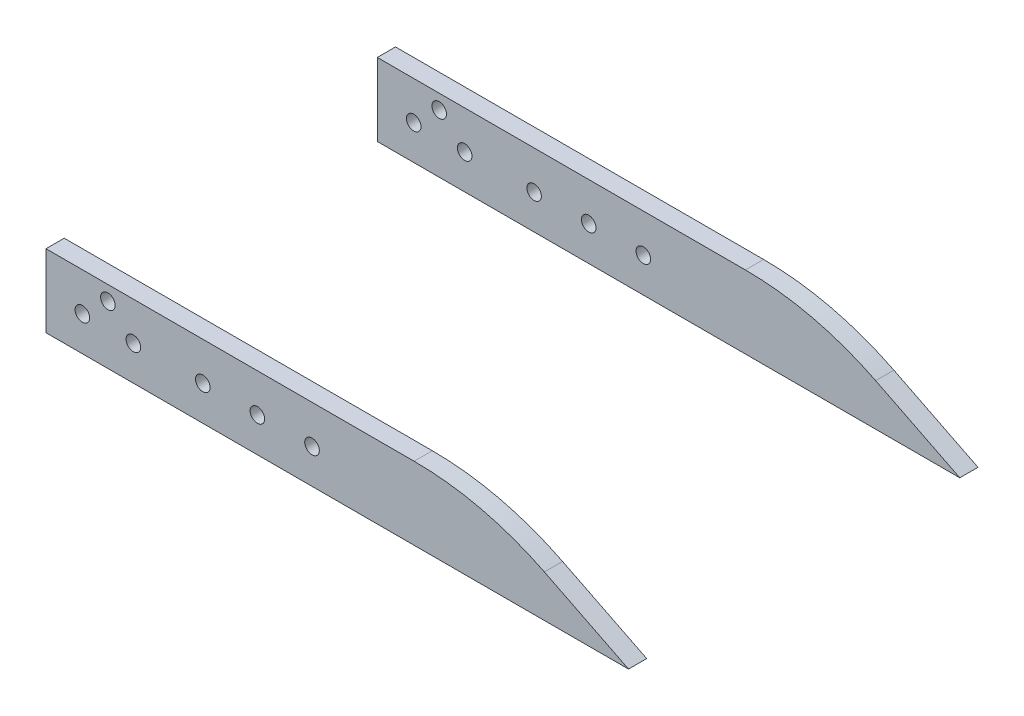
ISO-10303-21;
HEADER;
FILE_DESCRIPTION(('STEP AP214'),'2;1');
FILE_NAME('part.step','',(''),(''),'','','');
FILE_SCHEMA(('AUTOMOTIVE_DESIGN { 1 0 10303 214 1 1 1 1 }'));
ENDSEC;
DATA;
#1=APPLICATION_CONTEXT('core data for automotive mechanical design processes');
#2=APPLICATION_PROTOCOL_DEFINITION('international standard','automotive_design',2000,#1);
#3=PRODUCT_CONTEXT('',#1,'mechanical');
#4=PRODUCT('Part','Part','',(#3));
#5=PRODUCT_RELATED_PRODUCT_CATEGORY('part','',(#4));
#6=PRODUCT_DEFINITION_FORMATION('','',#4);
#7=PRODUCT_DEFINITION_CONTEXT('part definition',#1,'design');
#8=PRODUCT_DEFINITION('design','',#6,#7);
#9=PRODUCT_DEFINITION_SHAPE('','',#8);
#10=(LENGTH_UNIT() NAMED_UNIT(*) SI_UNIT(.MILLI.,.METRE.));
#11=(NAMED_UNIT(*) PLANE_ANGLE_UNIT() SI_UNIT($,.RADIAN.));
#12=(NAMED_UNIT(*) SI_UNIT($,.STERADIAN.) SOLID_ANGLE_UNIT());
#13=UNCERTAINTY_MEASURE_WITH_UNIT(LENGTH_MEASURE(1.E-05),#10,'distance_accuracy_value','');
#14=(GEOMETRIC_REPRESENTATION_CONTEXT(3) GLOBAL_UNCERTAINTY_ASSIGNED_CONTEXT((#13)) GLOBAL_UNIT_ASSIGNED_CONTEXT((#10,
#11,#12)) REPRESENTATION_CONTEXT('',''));
#15=CARTESIAN_POINT('',(0.,0.,0.));
#16=DIRECTION('',(0.,0.,1.));
#17=DIRECTION('',(1.,0.,0.));
#18=AXIS2_PLACEMENT_3D('',#15,#16,#17);
#19=CARTESIAN_POINT('',(0.,0.,5.));
#20=DIRECTION('',(0.,-1.,0.));
#21=DIRECTION('',(0.,0.,-1.));
#22=AXIS2_PLACEMENT_3D('',#19,#20,#21);
#23=PLANE('',#22);
#24=DIRECTION('',(-1.,0.,0.));
#25=VECTOR('',#24,1.);
#26=CARTESIAN_POINT('',(0.,0.,0.));
#27=LINE('',#26,#25);
#28=CARTESIAN_POINT('',(101.114561800017,0.,0.));
#29=VERTEX_POINT('',#28);
#30=CARTESIAN_POINT('',(0.,0.,0.));
#31=VERTEX_POINT('',#30);
#32=EDGE_CURVE('E116',#29,#31,#27,.T.);
#33=ORIENTED_EDGE('',*,*,#32,.T.);
#34=DIRECTION('',(0.,0.,-1.));
#35=VECTOR('',#34,1.);
#36=CARTESIAN_POINT('',(0.,0.,5.));
#37=LINE('',#36,#35);
#38=CARTESIAN_POINT('',(0.,0.,5.));
#39=VERTEX_POINT('',#38);
#40=EDGE_CURVE('E12',#39,#31,#37,.T.);
#41=ORIENTED_EDGE('',*,*,#40,.F.);
#42=DIRECTION('',(-1.,0.,0.));
#43=VECTOR('',#42,1.);
#44=CARTESIAN_POINT('',(0.,0.,5.));
#45=LINE('',#44,#43);
#46=CARTESIAN_POINT('',(101.114561800017,0.,5.));
#47=VERTEX_POINT('',#46);
#48=EDGE_CURVE('E125',#47,#39,#45,.T.);
#49=ORIENTED_EDGE('',*,*,#48,.F.);
#50=DIRECTION('',(0.,0.,-1.));
#51=VECTOR('',#50,1.);
#52=CARTESIAN_POINT('',(101.114561800017,0.,5.));
#53=LINE('',#52,#51);
#54=EDGE_CURVE('E112',#47,#29,#53,.T.);
#55=ORIENTED_EDGE('',*,*,#54,.T.);
#56=EDGE_LOOP('',(#33,#41,#49,#55));
#57=FACE_BOUND('',#56,.T.);
#58=ADVANCED_FACE('F42',(#57),#23,.F.);
#59=CARTESIAN_POINT('',(0.,0.,5.));
#60=DIRECTION('',(1.,0.,0.));
#61=DIRECTION('',(0.,1.,0.));
#62=AXIS2_PLACEMENT_3D('',#59,#60,#61);
#63=PLANE('',#62);
#64=DIRECTION('',(0.,-1.,0.));
#65=VECTOR('',#64,1.);
#66=CARTESIAN_POINT('',(0.,0.,0.));
#67=LINE('',#66,#65);
#68=CARTESIAN_POINT('',(0.,-20.,0.));
#69=VERTEX_POINT('',#68);
#70=EDGE_CURVE('E119',#31,#69,#67,.T.);
#71=ORIENTED_EDGE('',*,*,#70,.T.);
#72=DIRECTION('',(0.,0.,-1.));
#73=VECTOR('',#72,1.);
#74=CARTESIAN_POINT('',(0.,-20.,5.));
#75=LINE('',#74,#73);
#76=CARTESIAN_POINT('',(0.,-20.,5.));
#77=VERTEX_POINT('',#76);
#78=EDGE_CURVE('E50',#77,#69,#75,.T.);
#79=ORIENTED_EDGE('',*,*,#78,.F.);
#80=DIRECTION('',(0.,-1.,0.));
#81=VECTOR('',#80,1.);
#82=CARTESIAN_POINT('',(0.,0.,5.));
#83=LINE('',#82,#81);
#84=EDGE_CURVE('E92',#39,#77,#83,.T.);
#85=ORIENTED_EDGE('',*,*,#84,.F.);
#86=ORIENTED_EDGE('',*,*,#40,.T.);
#87=EDGE_LOOP('',(#71,#79,#85,#86));
#88=FACE_BOUND('',#87,.T.);
#89=ADVANCED_FACE('F146',(#88),#63,.F.);
#90=CARTESIAN_POINT('',(0.,-20.,5.));
#91=DIRECTION('',(0.,1.,0.));
#92=DIRECTION('',(0.,0.,1.));
#93=AXIS2_PLACEMENT_3D('',#90,#91,#92);
#94=PLANE('',#93);
#95=DIRECTION('',(1.,0.,0.));
#96=VECTOR('',#95,1.);
#97=CARTESIAN_POINT('',(0.,-20.,0.));
#98=LINE('',#97,#96);
#99=CARTESIAN_POINT('',(160.,-20.,0.));
#100=VERTEX_POINT('',#99);
#101=EDGE_CURVE('E107',#69,#100,#98,.T.);
#102=ORIENTED_EDGE('',*,*,#101,.T.);
#103=DIRECTION('',(0.,0.,-1.));
#104=VECTOR('',#103,1.);
#105=CARTESIAN_POINT('',(160.,-20.,5.));
#106=LINE('',#105,#104);
#107=CARTESIAN_POINT('',(160.,-20.,5.));
#108=VERTEX_POINT('',#107);
#109=EDGE_CURVE('E104',#108,#100,#106,.T.);
#110=ORIENTED_EDGE('',*,*,#109,.F.);
#111=DIRECTION('',(1.,0.,0.));
#112=VECTOR('',#111,1.);
#113=CARTESIAN_POINT('',(0.,-20.,5.));
#114=LINE('',#113,#112);
#115=EDGE_CURVE('E96',#77,#108,#114,.T.);
#116=ORIENTED_EDGE('',*,*,#115,.F.);
#117=ORIENTED_EDGE('',*,*,#78,.T.);
#118=EDGE_LOOP('',(#102,#110,#116,#117));
#119=FACE_BOUND('',#118,.T.);
#120=ADVANCED_FACE('F105',(#119),#94,.F.);
#121=CARTESIAN_POINT('',(136.891649440014,-8.44582472000675,5.));
#122=DIRECTION('',(-0.447213595499958,-0.894427190999916,0.));
#123=DIRECTION('',(0.894427190999916,-0.447213595499958,0.));
#124=AXIS2_PLACEMENT_3D('',#121,#122,#123);
#125=PLANE('',#124);
#126=DIRECTION('',(-0.894427190999916,0.447213595499958,0.));
#127=VECTOR('',#126,1.);
#128=CARTESIAN_POINT('',(136.891649440014,-8.44582472000675,0.));
#129=LINE('',#128,#127);
#130=CARTESIAN_POINT('',(136.891649440014,-8.44582472000675,0.));
#131=VERTEX_POINT('',#130);
#132=EDGE_CURVE('E78',#100,#131,#129,.T.);
#133=ORIENTED_EDGE('',*,*,#132,.T.);
#134=DIRECTION('',(0.,0.,-1.));
#135=VECTOR('',#134,1.);
#136=CARTESIAN_POINT('',(136.891649440014,-8.44582472000675,5.));
#137=LINE('',#136,#135);
#138=CARTESIAN_POINT('',(136.891649440014,-8.44582472000675,5.));
#139=VERTEX_POINT('',#138);
#140=EDGE_CURVE('E108',#139,#131,#137,.T.);
#141=ORIENTED_EDGE('',*,*,#140,.F.);
#142=DIRECTION('',(-0.894427190999916,0.447213595499958,0.));
#143=VECTOR('',#142,1.);
#144=CARTESIAN_POINT('',(136.891649440014,-8.44582472000675,5.));
#145=LINE('',#144,#143);
#146=EDGE_CURVE('E100',#108,#139,#145,.T.);
#147=ORIENTED_EDGE('',*,*,#146,.F.);
#148=ORIENTED_EDGE('',*,*,#109,.T.);
#149=EDGE_LOOP('',(#133,#141,#147,#148));
#150=FACE_BOUND('',#149,.T.);
#151=ADVANCED_FACE('F110',(#150),#125,.F.);
#152=CARTESIAN_POINT('',(101.114561800017,-80.,5.));
#153=DIRECTION('',(0.,0.,-1.));
#154=DIRECTION('',(-1.,0.,0.));
#155=AXIS2_PLACEMENT_3D('',#152,#153,#154);
#156=CYLINDRICAL_SURFACE('',#155,80.);
#157=CARTESIAN_POINT('',(101.114561800017,-80.,0.));
#158=DIRECTION('',(0.,0.,1.));
#159=DIRECTION('',(-1.,0.,0.));
#160=AXIS2_PLACEMENT_3D('',#157,#158,#159);
#161=CIRCLE('',#160,80.);
#162=EDGE_CURVE('E84',#131,#29,#161,.T.);
#163=ORIENTED_EDGE('',*,*,#162,.T.);
#164=ORIENTED_EDGE('',*,*,#54,.F.);
#165=CARTESIAN_POINT('',(101.114561800017,-80.,5.));
#166=DIRECTION('',(0.,0.,1.));
#167=DIRECTION('',(-1.,0.,0.));
#168=AXIS2_PLACEMENT_3D('',#165,#166,#167);
#169=CIRCLE('',#168,80.);
#170=EDGE_CURVE('E58',#139,#47,#169,.T.);
#171=ORIENTED_EDGE('',*,*,#170,.F.);
#172=ORIENTED_EDGE('',*,*,#140,.T.);
#173=EDGE_LOOP('',(#163,#164,#171,#172));
#174=FACE_BOUND('',#173,.T.);
#175=ADVANCED_FACE('F133',(#174),#156,.T.);
#176=CARTESIAN_POINT('',(101.114561800017,-80.,5.));
#177=DIRECTION('',(0.,0.,-1.));
#178=DIRECTION('',(-1.,0.,0.));
#179=AXIS2_PLACEMENT_3D('',#176,#177,#178);
#180=PLANE('',#179);
#181=CARTESIAN_POINT('',(10.,-10.5,5.));
#182=DIRECTION('',(0.,0.,-1.));
#183=DIRECTION('',(-1.,0.,0.));
#184=AXIS2_PLACEMENT_3D('',#181,#182,#183);
#185=CIRCLE('',#184,2.);
#186=CARTESIAN_POINT('',(8.,-10.5,5.));
#187=VERTEX_POINT('',#186);
#188=EDGE_CURVE('E120',#187,#187,#185,.T.);
#189=ORIENTED_EDGE('',*,*,#188,.T.);
#190=EDGE_LOOP('',(#189));
#191=FACE_BOUND('',#190,.T.);
#192=CARTESIAN_POINT('',(16.9999999999999,-3.99999999999997,5.));
#193=DIRECTION('',(0.,0.,-1.));
#194=DIRECTION('',(-1.,0.,0.));
#195=AXIS2_PLACEMENT_3D('',#192,#193,#194);
#196=CIRCLE('',#195,2.);
#197=CARTESIAN_POINT('',(14.9999999999999,-3.99999999999997,5.));
#198=VERTEX_POINT('',#197);
#199=EDGE_CURVE('E243',#198,#198,#196,.T.);
#200=ORIENTED_EDGE('',*,*,#199,.T.);
#201=EDGE_LOOP('',(#200));
#202=FACE_BOUND('',#201,.T.);
#203=CARTESIAN_POINT('',(23.9999999999997,-10.5,5.));
#204=DIRECTION('',(0.,0.,-1.));
#205=DIRECTION('',(-1.,0.,0.));
#206=AXIS2_PLACEMENT_3D('',#203,#204,#205);
#207=CIRCLE('',#206,1.99999999999999);
#208=CARTESIAN_POINT('',(21.9999999999997,-10.5,5.));
#209=VERTEX_POINT('',#208);
#210=EDGE_CURVE('E246',#209,#209,#207,.T.);
#211=ORIENTED_EDGE('',*,*,#210,.T.);
#212=EDGE_LOOP('',(#211));
#213=FACE_BOUND('',#212,.T.);
#214=CARTESIAN_POINT('',(43.0685996903476,-10.5000000000002,5.));
#215=DIRECTION('',(0.,0.,-1.));
#216=DIRECTION('',(-1.,0.,0.));
#217=AXIS2_PLACEMENT_3D('',#214,#215,#216);
#218=CIRCLE('',#217,2.);
#219=CARTESIAN_POINT('',(41.0685996903476,-10.5000000000002,5.));
#220=VERTEX_POINT('',#219);
#221=EDGE_CURVE('E252',#220,#220,#218,.T.);
#222=ORIENTED_EDGE('',*,*,#221,.T.);
#223=EDGE_LOOP('',(#222));
#224=FACE_BOUND('',#223,.T.);
#225=CARTESIAN_POINT('',(58.0685996903476,-10.5000000000001,5.));
#226=DIRECTION('',(0.,0.,-1.));
#227=DIRECTION('',(-1.,0.,0.));
#228=AXIS2_PLACEMENT_3D('',#225,#226,#227);
#229=CIRCLE('',#228,2.);
#230=CARTESIAN_POINT('',(56.0685996903476,-10.5000000000001,5.));
#231=VERTEX_POINT('',#230);
#232=EDGE_CURVE('E255',#231,#231,#229,.T.);
#233=ORIENTED_EDGE('',*,*,#232,.T.);
#234=EDGE_LOOP('',(#233));
#235=FACE_BOUND('',#234,.T.);
#236=CARTESIAN_POINT('',(73.0685996903476,-10.5,5.));
#237=DIRECTION('',(0.,0.,-1.));
#238=DIRECTION('',(-1.,0.,0.));
#239=AXIS2_PLACEMENT_3D('',#236,#237,#238);
#240=CIRCLE('',#239,2.);
#241=CARTESIAN_POINT('',(71.0685996903476,-10.5,5.));
#242=VERTEX_POINT('',#241);
#243=EDGE_CURVE('E258',#242,#242,#240,.T.);
#244=ORIENTED_EDGE('',*,*,#243,.T.);
#245=EDGE_LOOP('',(#244));
#246=FACE_BOUND('',#245,.T.);
#247=ORIENTED_EDGE('',*,*,#48,.T.);
#248=ORIENTED_EDGE('',*,*,#84,.T.);
#249=ORIENTED_EDGE('',*,*,#115,.T.);
#250=ORIENTED_EDGE('',*,*,#146,.T.);
#251=ORIENTED_EDGE('',*,*,#170,.T.);
#252=EDGE_LOOP('',(#247,#248,#249,#250,#251));
#253=FACE_BOUND('',#252,.T.);
#254=ADVANCED_FACE('F98',(#191,#202,#213,#224,#235,#246,#253),#180,.F.);
#255=CARTESIAN_POINT('',(101.114561800017,-80.,0.));
#256=DIRECTION('',(0.,0.,-1.));
#257=DIRECTION('',(-1.,0.,0.));
#258=AXIS2_PLACEMENT_3D('',#255,#256,#257);
#259=PLANE('',#258);
#260=CARTESIAN_POINT('',(10.,-10.5,0.));
#261=DIRECTION('',(0.,0.,1.));
#262=DIRECTION('',(1.,0.,0.));
#263=AXIS2_PLACEMENT_3D('',#260,#261,#262);
#264=CIRCLE('',#263,2.);
#265=CARTESIAN_POINT('',(12.,-10.5,0.));
#266=VERTEX_POINT('',#265);
#267=EDGE_CURVE('E240',#266,#266,#264,.T.);
#268=ORIENTED_EDGE('',*,*,#267,.T.);
#269=EDGE_LOOP('',(#268));
#270=FACE_BOUND('',#269,.T.);
#271=CARTESIAN_POINT('',(16.9999999999999,-3.99999999999997,0.));
#272=DIRECTION('',(0.,0.,1.));
#273=DIRECTION('',(1.,0.,0.));
#274=AXIS2_PLACEMENT_3D('',#271,#272,#273);
#275=CIRCLE('',#274,2.);
#276=CARTESIAN_POINT('',(18.9999999999999,-3.99999999999997,0.));
#277=VERTEX_POINT('',#276);
#278=EDGE_CURVE('E273',#277,#277,#275,.T.);
#279=ORIENTED_EDGE('',*,*,#278,.T.);
#280=EDGE_LOOP('',(#279));
#281=FACE_BOUND('',#280,.T.);
#282=CARTESIAN_POINT('',(23.9999999999997,-10.5,0.));
#283=DIRECTION('',(0.,0.,1.));
#284=DIRECTION('',(1.,0.,0.));
#285=AXIS2_PLACEMENT_3D('',#282,#283,#284);
#286=CIRCLE('',#285,1.99999999999999);
#287=CARTESIAN_POINT('',(25.9999999999997,-10.5,0.));
#288=VERTEX_POINT('',#287);
#289=EDGE_CURVE('E270',#288,#288,#286,.T.);
#290=ORIENTED_EDGE('',*,*,#289,.T.);
#291=EDGE_LOOP('',(#290));
#292=FACE_BOUND('',#291,.T.);
#293=CARTESIAN_POINT('',(43.0685996903476,-10.5000000000002,0.));
#294=DIRECTION('',(0.,0.,1.));
#295=DIRECTION('',(1.,0.,0.));
#296=AXIS2_PLACEMENT_3D('',#293,#294,#295);
#297=CIRCLE('',#296,2.);
#298=CARTESIAN_POINT('',(45.0685996903476,-10.5000000000002,0.));
#299=VERTEX_POINT('',#298);
#300=EDGE_CURVE('E267',#299,#299,#297,.T.);
#301=ORIENTED_EDGE('',*,*,#300,.T.);
#302=EDGE_LOOP('',(#301));
#303=FACE_BOUND('',#302,.T.);
#304=CARTESIAN_POINT('',(58.0685996903476,-10.5000000000001,0.));
#305=DIRECTION('',(0.,0.,1.));
#306=DIRECTION('',(1.,0.,0.));
#307=AXIS2_PLACEMENT_3D('',#304,#305,#306);
#308=CIRCLE('',#307,2.);
#309=CARTESIAN_POINT('',(60.0685996903476,-10.5000000000001,0.));
#310=VERTEX_POINT('',#309);
#311=EDGE_CURVE('E264',#310,#310,#308,.T.);
#312=ORIENTED_EDGE('',*,*,#311,.T.);
#313=EDGE_LOOP('',(#312));
#314=FACE_BOUND('',#313,.T.);
#315=CARTESIAN_POINT('',(73.0685996903476,-10.5,0.));
#316=DIRECTION('',(0.,0.,1.));
#317=DIRECTION('',(1.,0.,0.));
#318=AXIS2_PLACEMENT_3D('',#315,#316,#317);
#319=CIRCLE('',#318,2.);
#320=CARTESIAN_POINT('',(75.0685996903476,-10.5,0.));
#321=VERTEX_POINT('',#320);
#322=EDGE_CURVE('E261',#321,#321,#319,.T.);
#323=ORIENTED_EDGE('',*,*,#322,.T.);
#324=EDGE_LOOP('',(#323));
#325=FACE_BOUND('',#324,.T.);
#326=ORIENTED_EDGE('',*,*,#32,.F.);
#327=ORIENTED_EDGE('',*,*,#162,.F.);
#328=ORIENTED_EDGE('',*,*,#132,.F.);
#329=ORIENTED_EDGE('',*,*,#101,.F.);
#330=ORIENTED_EDGE('',*,*,#70,.F.);
#331=EDGE_LOOP('',(#326,#327,#328,#329,#330));
#332=FACE_BOUND('',#331,.T.);
#333=ADVANCED_FACE('F129',(#270,#281,#292,#303,#314,#325,#332),#259,.T.);
#334=CARTESIAN_POINT('',(73.0685996903476,-10.5,0.));
#335=DIRECTION('',(0.,0.,1.));
#336=DIRECTION('',(1.,0.,0.));
#337=AXIS2_PLACEMENT_3D('',#334,#335,#336);
#338=CYLINDRICAL_SURFACE('',#337,2.);
#339=ORIENTED_EDGE('',*,*,#322,.F.);
#340=EDGE_LOOP('',(#339));
#341=FACE_BOUND('',#340,.T.);
#342=ORIENTED_EDGE('',*,*,#243,.F.);
#343=EDGE_LOOP('',(#342));
#344=FACE_BOUND('',#343,.T.);
#345=ADVANCED_FACE('F175',(#341,#344),#338,.F.);
#346=CARTESIAN_POINT('',(58.0685996903476,-10.5000000000001,0.));
#347=DIRECTION('',(0.,0.,1.));
#348=DIRECTION('',(1.,0.,0.));
#349=AXIS2_PLACEMENT_3D('',#346,#347,#348);
#350=CYLINDRICAL_SURFACE('',#349,2.);
#351=ORIENTED_EDGE('',*,*,#311,.F.);
#352=EDGE_LOOP('',(#351));
#353=FACE_BOUND('',#352,.T.);
#354=ORIENTED_EDGE('',*,*,#232,.F.);
#355=EDGE_LOOP('',(#354));
#356=FACE_BOUND('',#355,.T.);
#357=ADVANCED_FACE('F183',(#353,#356),#350,.F.);
#358=CARTESIAN_POINT('',(43.0685996903476,-10.5000000000002,0.));
#359=DIRECTION('',(0.,0.,1.));
#360=DIRECTION('',(1.,0.,0.));
#361=AXIS2_PLACEMENT_3D('',#358,#359,#360);
#362=CYLINDRICAL_SURFACE('',#361,2.);
#363=ORIENTED_EDGE('',*,*,#300,.F.);
#364=EDGE_LOOP('',(#363));
#365=FACE_BOUND('',#364,.T.);
#366=ORIENTED_EDGE('',*,*,#221,.F.);
#367=EDGE_LOOP('',(#366));
#368=FACE_BOUND('',#367,.T.);
#369=ADVANCED_FACE('F193',(#365,#368),#362,.F.);
#370=CARTESIAN_POINT('',(23.9999999999997,-10.5,0.));
#371=DIRECTION('',(0.,0.,1.));
#372=DIRECTION('',(1.,0.,0.));
#373=AXIS2_PLACEMENT_3D('',#370,#371,#372);
#374=CYLINDRICAL_SURFACE('',#373,1.99999999999999);
#375=ORIENTED_EDGE('',*,*,#289,.F.);
#376=EDGE_LOOP('',(#375));
#377=FACE_BOUND('',#376,.T.);
#378=ORIENTED_EDGE('',*,*,#210,.F.);
#379=EDGE_LOOP('',(#378));
#380=FACE_BOUND('',#379,.T.);
#381=ADVANCED_FACE('F203',(#377,#380),#374,.F.);
#382=CARTESIAN_POINT('',(16.9999999999999,-3.99999999999997,0.));
#383=DIRECTION('',(0.,0.,1.));
#384=DIRECTION('',(1.,0.,0.));
#385=AXIS2_PLACEMENT_3D('',#382,#383,#384);
#386=CYLINDRICAL_SURFACE('',#385,2.);
#387=ORIENTED_EDGE('',*,*,#278,.F.);
#388=EDGE_LOOP('',(#387));
#389=FACE_BOUND('',#388,.T.);
#390=ORIENTED_EDGE('',*,*,#199,.F.);
#391=EDGE_LOOP('',(#390));
#392=FACE_BOUND('',#391,.T.);
#393=ADVANCED_FACE('F213',(#389,#392),#386,.F.);
#394=CARTESIAN_POINT('',(10.,-10.5,0.));
#395=DIRECTION('',(0.,0.,1.));
#396=DIRECTION('',(1.,0.,0.));
#397=AXIS2_PLACEMENT_3D('',#394,#395,#396);
#398=CYLINDRICAL_SURFACE('',#397,2.);
#399=ORIENTED_EDGE('',*,*,#267,.F.);
#400=EDGE_LOOP('',(#399));
#401=FACE_BOUND('',#400,.T.);
#402=ORIENTED_EDGE('',*,*,#188,.F.);
#403=EDGE_LOOP('',(#402));
#404=FACE_BOUND('',#403,.T.);
#405=ADVANCED_FACE('F223',(#401,#404),#398,.F.);
#406=CLOSED_SHELL('',(#58,#89,#120,#151,#175,#254,#333,#345,#357,#369,#381,#393,#405));
#407=MANIFOLD_SOLID_BREP('B2',#406);
#408=CARTESIAN_POINT('',(0.,0.,96.));
#409=DIRECTION('',(0.,-1.,0.));
#410=DIRECTION('',(0.,0.,-1.));
#411=AXIS2_PLACEMENT_3D('',#408,#409,#410);
#412=PLANE('',#411);
#413=DIRECTION('',(-1.,0.,0.));
#414=VECTOR('',#413,1.);
#415=CARTESIAN_POINT('',(0.,0.,91.));
#416=LINE('',#415,#414);
#417=CARTESIAN_POINT('',(101.114561800017,0.,91.));
#418=VERTEX_POINT('',#417);
#419=CARTESIAN_POINT('',(0.,0.,91.));
#420=VERTEX_POINT('',#419);
#421=EDGE_CURVE('E393',#418,#420,#416,.T.);
#422=ORIENTED_EDGE('',*,*,#421,.T.);
#423=DIRECTION('',(0.,0.,-1.));
#424=VECTOR('',#423,1.);
#425=CARTESIAN_POINT('',(0.,0.,96.));
#426=LINE('',#425,#424);
#427=CARTESIAN_POINT('',(0.,0.,96.));
#428=VERTEX_POINT('',#427);
#429=EDGE_CURVE('E40',#428,#420,#426,.T.);
#430=ORIENTED_EDGE('',*,*,#429,.F.);
#431=DIRECTION('',(-1.,0.,0.));
#432=VECTOR('',#431,1.);
#433=CARTESIAN_POINT('',(0.,0.,96.));
#434=LINE('',#433,#432);
#435=CARTESIAN_POINT('',(101.114561800017,0.,96.));
#436=VERTEX_POINT('',#435);
#437=EDGE_CURVE('E401',#436,#428,#434,.T.);
#438=ORIENTED_EDGE('',*,*,#437,.F.);
#439=DIRECTION('',(0.,0.,-1.));
#440=VECTOR('',#439,1.);
#441=CARTESIAN_POINT('',(101.114561800017,0.,96.));
#442=LINE('',#441,#440);
#443=EDGE_CURVE('E389',#436,#418,#442,.T.);
#444=ORIENTED_EDGE('',*,*,#443,.T.);
#445=EDGE_LOOP('',(#422,#430,#438,#444));
#446=FACE_BOUND('',#445,.T.);
#447=ADVANCED_FACE('F317',(#446),#412,.F.);
#448=CARTESIAN_POINT('',(0.,0.,96.));
#449=DIRECTION('',(1.,0.,0.));
#450=DIRECTION('',(0.,1.,0.));
#451=AXIS2_PLACEMENT_3D('',#448,#449,#450);
#452=PLANE('',#451);
#453=DIRECTION('',(0.,-1.,0.));
#454=VECTOR('',#453,1.);
#455=CARTESIAN_POINT('',(0.,0.,91.));
#456=LINE('',#455,#454);
#457=CARTESIAN_POINT('',(0.,-20.,91.));
#458=VERTEX_POINT('',#457);
#459=EDGE_CURVE('E396',#420,#458,#456,.T.);
#460=ORIENTED_EDGE('',*,*,#459,.T.);
#461=DIRECTION('',(0.,0.,-1.));
#462=VECTOR('',#461,1.);
#463=CARTESIAN_POINT('',(0.,-20.,96.));
#464=LINE('',#463,#462);
#465=CARTESIAN_POINT('',(0.,-20.,96.));
#466=VERTEX_POINT('',#465);
#467=EDGE_CURVE('E326',#466,#458,#464,.T.);
#468=ORIENTED_EDGE('',*,*,#467,.F.);
#469=DIRECTION('',(0.,-1.,0.));
#470=VECTOR('',#469,1.);
#471=CARTESIAN_POINT('',(0.,0.,96.));
#472=LINE('',#471,#470);
#473=EDGE_CURVE('E369',#428,#466,#472,.T.);
#474=ORIENTED_EDGE('',*,*,#473,.F.);
#475=ORIENTED_EDGE('',*,*,#429,.T.);
#476=EDGE_LOOP('',(#460,#468,#474,#475));
#477=FACE_BOUND('',#476,.T.);
#478=ADVANCED_FACE('F457',(#477),#452,.F.);
#479=CARTESIAN_POINT('',(0.,-20.,96.));
#480=DIRECTION('',(0.,1.,0.));
#481=DIRECTION('',(0.,0.,1.));
#482=AXIS2_PLACEMENT_3D('',#479,#480,#481);
#483=PLANE('',#482);
#484=DIRECTION('',(1.,0.,0.));
#485=VECTOR('',#484,1.);
#486=CARTESIAN_POINT('',(0.,-20.,91.));
#487=LINE('',#486,#485);
#488=CARTESIAN_POINT('',(160.,-20.,91.));
#489=VERTEX_POINT('',#488);
#490=EDGE_CURVE('E384',#458,#489,#487,.T.);
#491=ORIENTED_EDGE('',*,*,#490,.T.);
#492=DIRECTION('',(0.,0.,-1.));
#493=VECTOR('',#492,1.);
#494=CARTESIAN_POINT('',(160.,-20.,96.));
#495=LINE('',#494,#493);
#496=CARTESIAN_POINT('',(160.,-20.,96.));
#497=VERTEX_POINT('',#496);
#498=EDGE_CURVE('E381',#497,#489,#495,.T.);
#499=ORIENTED_EDGE('',*,*,#498,.F.);
#500=DIRECTION('',(1.,0.,0.));
#501=VECTOR('',#500,1.);
#502=CARTESIAN_POINT('',(0.,-20.,96.));
#503=LINE('',#502,#501);
#504=EDGE_CURVE('E373',#466,#497,#503,.T.);
#505=ORIENTED_EDGE('',*,*,#504,.F.);
#506=ORIENTED_EDGE('',*,*,#467,.T.);
#507=EDGE_LOOP('',(#491,#499,#505,#506));
#508=FACE_BOUND('',#507,.T.);
#509=ADVANCED_FACE('F382',(#508),#483,.F.);
#510=CARTESIAN_POINT('',(136.891649440014,-8.44582472000675,96.));
#511=DIRECTION('',(-0.447213595499958,-0.894427190999916,0.));
#512=DIRECTION('',(0.894427190999916,-0.447213595499958,0.));
#513=AXIS2_PLACEMENT_3D('',#510,#511,#512);
#514=PLANE('',#513);
#515=DIRECTION('',(-0.894427190999916,0.447213595499958,0.));
#516=VECTOR('',#515,1.);
#517=CARTESIAN_POINT('',(136.891649440014,-8.44582472000675,91.));
#518=LINE('',#517,#516);
#519=CARTESIAN_POINT('',(136.891649440014,-8.44582472000675,91.));
#520=VERTEX_POINT('',#519);
#521=EDGE_CURVE('E355',#489,#520,#518,.T.);
#522=ORIENTED_EDGE('',*,*,#521,.T.);
#523=DIRECTION('',(0.,0.,-1.));
#524=VECTOR('',#523,1.);
#525=CARTESIAN_POINT('',(136.891649440014,-8.44582472000675,96.));
#526=LINE('',#525,#524);
#527=CARTESIAN_POINT('',(136.891649440014,-8.44582472000675,96.));
#528=VERTEX_POINT('',#527);
#529=EDGE_CURVE('E385',#528,#520,#526,.T.);
#530=ORIENTED_EDGE('',*,*,#529,.F.);
#531=DIRECTION('',(-0.894427190999916,0.447213595499958,0.));
#532=VECTOR('',#531,1.);
#533=CARTESIAN_POINT('',(136.891649440014,-8.44582472000675,96.));
#534=LINE('',#533,#532);
#535=EDGE_CURVE('E377',#497,#528,#534,.T.);
#536=ORIENTED_EDGE('',*,*,#535,.F.);
#537=ORIENTED_EDGE('',*,*,#498,.T.);
#538=EDGE_LOOP('',(#522,#530,#536,#537));
#539=FACE_BOUND('',#538,.T.);
#540=ADVANCED_FACE('F387',(#539),#514,.F.);
#541=CARTESIAN_POINT('',(101.114561800017,-80.,96.));
#542=DIRECTION('',(0.,0.,-1.));
#543=DIRECTION('',(-1.,0.,0.));
#544=AXIS2_PLACEMENT_3D('',#541,#542,#543);
#545=CYLINDRICAL_SURFACE('',#544,80.);
#546=CARTESIAN_POINT('',(101.114561800017,-80.,91.));
#547=DIRECTION('',(0.,0.,1.));
#548=DIRECTION('',(-1.,0.,0.));
#549=AXIS2_PLACEMENT_3D('',#546,#547,#548);
#550=CIRCLE('',#549,80.);
#551=EDGE_CURVE('E361',#520,#418,#550,.T.);
#552=ORIENTED_EDGE('',*,*,#551,.T.);
#553=ORIENTED_EDGE('',*,*,#443,.F.);
#554=CARTESIAN_POINT('',(101.114561800017,-80.,96.));
#555=DIRECTION('',(0.,0.,1.));
#556=DIRECTION('',(-1.,0.,0.));
#557=AXIS2_PLACEMENT_3D('',#554,#555,#556);
#558=CIRCLE('',#557,80.);
#559=EDGE_CURVE('E335',#528,#436,#558,.T.);
#560=ORIENTED_EDGE('',*,*,#559,.F.);
#561=ORIENTED_EDGE('',*,*,#529,.T.);
#562=EDGE_LOOP('',(#552,#553,#560,#561));
#563=FACE_BOUND('',#562,.T.);
#564=ADVANCED_FACE('F445',(#563),#545,.T.);
#565=CARTESIAN_POINT('',(101.114561800017,-80.,96.));
#566=DIRECTION('',(0.,0.,-1.));
#567=DIRECTION('',(-1.,0.,0.));
#568=AXIS2_PLACEMENT_3D('',#565,#566,#567);
#569=PLANE('',#568);
#570=CARTESIAN_POINT('',(10.,-10.5,96.));
#571=DIRECTION('',(0.,0.,1.));
#572=DIRECTION('',(1.,0.,0.));
#573=AXIS2_PLACEMENT_3D('',#570,#571,#572);
#574=CIRCLE('',#573,2.);
#575=CARTESIAN_POINT('',(12.,-10.5,96.));
#576=VERTEX_POINT('',#575);
#577=EDGE_CURVE('E409',#576,#576,#574,.T.);
#578=ORIENTED_EDGE('',*,*,#577,.F.);
#579=EDGE_LOOP('',(#578));
#580=FACE_BOUND('',#579,.T.);
#581=CARTESIAN_POINT('',(16.9999999999999,-3.99999999999997,96.));
#582=DIRECTION('',(0.,0.,1.));
#583=DIRECTION('',(1.,0.,0.));
#584=AXIS2_PLACEMENT_3D('',#581,#582,#583);
#585=CIRCLE('',#584,2.);
#586=CARTESIAN_POINT('',(18.9999999999999,-3.99999999999997,96.));
#587=VERTEX_POINT('',#586);
#588=EDGE_CURVE('E545',#587,#587,#585,.T.);
#589=ORIENTED_EDGE('',*,*,#588,.F.);
#590=EDGE_LOOP('',(#589));
#591=FACE_BOUND('',#590,.T.);
#592=CARTESIAN_POINT('',(23.9999999999997,-10.5,96.));
#593=DIRECTION('',(0.,0.,1.));
#594=DIRECTION('',(1.,0.,0.));
#595=AXIS2_PLACEMENT_3D('',#592,#593,#594);
#596=CIRCLE('',#595,1.99999999999999);
#597=CARTESIAN_POINT('',(25.9999999999997,-10.5,96.));
#598=VERTEX_POINT('',#597);
#599=EDGE_CURVE('E547',#598,#598,#596,.T.);
#600=ORIENTED_EDGE('',*,*,#599,.F.);
#601=EDGE_LOOP('',(#600));
#602=FACE_BOUND('',#601,.T.);
#603=CARTESIAN_POINT('',(43.0685996903476,-10.5000000000002,96.));
#604=DIRECTION('',(0.,0.,1.));
#605=DIRECTION('',(1.,0.,0.));
#606=AXIS2_PLACEMENT_3D('',#603,#604,#605);
#607=CIRCLE('',#606,2.);
#608=CARTESIAN_POINT('',(45.0685996903476,-10.5000000000002,96.));
#609=VERTEX_POINT('',#608);
#610=EDGE_CURVE('E552',#609,#609,#607,.T.);
#611=ORIENTED_EDGE('',*,*,#610,.F.);
#612=EDGE_LOOP('',(#611));
#613=FACE_BOUND('',#612,.T.);
#614=CARTESIAN_POINT('',(58.0685996903476,-10.5000000000001,96.));
#615=DIRECTION('',(0.,0.,1.));
#616=DIRECTION('',(1.,0.,0.));
#617=AXIS2_PLACEMENT_3D('',#614,#615,#616);
#618=CIRCLE('',#617,2.);
#619=CARTESIAN_POINT('',(60.0685996903476,-10.5000000000001,96.));
#620=VERTEX_POINT('',#619);
#621=EDGE_CURVE('E557',#620,#620,#618,.T.);
#622=ORIENTED_EDGE('',*,*,#621,.F.);
#623=EDGE_LOOP('',(#622));
#624=FACE_BOUND('',#623,.T.);
#625=CARTESIAN_POINT('',(73.0685996903476,-10.5,96.));
#626=DIRECTION('',(0.,0.,1.));
#627=DIRECTION('',(1.,0.,0.));
#628=AXIS2_PLACEMENT_3D('',#625,#626,#627);
#629=CIRCLE('',#628,2.);
#630=CARTESIAN_POINT('',(75.0685996903476,-10.5,96.));
#631=VERTEX_POINT('',#630);
#632=EDGE_CURVE('E560',#631,#631,#629,.T.);
#633=ORIENTED_EDGE('',*,*,#632,.F.);
#634=EDGE_LOOP('',(#633));
#635=FACE_BOUND('',#634,.T.);
#636=ORIENTED_EDGE('',*,*,#437,.T.);
#637=ORIENTED_EDGE('',*,*,#473,.T.);
#638=ORIENTED_EDGE('',*,*,#504,.T.);
#639=ORIENTED_EDGE('',*,*,#535,.T.);
#640=ORIENTED_EDGE('',*,*,#559,.T.);
#641=EDGE_LOOP('',(#636,#637,#638,#639,#640));
#642=FACE_BOUND('',#641,.T.);
#643=ADVANCED_FACE('F375',(#580,#591,#602,#613,#624,#635,#642),#569,.F.);
#644=CARTESIAN_POINT('',(101.114561800017,-80.,91.));
#645=DIRECTION('',(0.,0.,-1.));
#646=DIRECTION('',(-1.,0.,0.));
#647=AXIS2_PLACEMENT_3D('',#644,#645,#646);
#648=PLANE('',#647);
#649=CARTESIAN_POINT('',(10.,-10.5,91.));
#650=DIRECTION('',(0.,0.,-1.));
#651=DIRECTION('',(-1.,0.,0.));
#652=AXIS2_PLACEMENT_3D('',#649,#650,#651);
#653=CIRCLE('',#652,2.);
#654=CARTESIAN_POINT('',(8.,-10.5,91.));
#655=VERTEX_POINT('',#654);
#656=EDGE_CURVE('E320',#655,#655,#653,.T.);
#657=ORIENTED_EDGE('',*,*,#656,.F.);
#658=EDGE_LOOP('',(#657));
#659=FACE_BOUND('',#658,.T.);
#660=CARTESIAN_POINT('',(16.9999999999999,-3.99999999999997,91.));
#661=DIRECTION('',(0.,0.,-1.));
#662=DIRECTION('',(-1.,0.,0.));
#663=AXIS2_PLACEMENT_3D('',#660,#661,#662);
#664=CIRCLE('',#663,2.);
#665=CARTESIAN_POINT('',(14.9999999999999,-3.99999999999997,91.));
#666=VERTEX_POINT('',#665);
#667=EDGE_CURVE('E417',#666,#666,#664,.T.);
#668=ORIENTED_EDGE('',*,*,#667,.F.);
#669=EDGE_LOOP('',(#668));
#670=FACE_BOUND('',#669,.T.);
#671=CARTESIAN_POINT('',(23.9999999999997,-10.5,91.));
#672=DIRECTION('',(0.,0.,-1.));
#673=DIRECTION('',(-1.,0.,0.));
#674=AXIS2_PLACEMENT_3D('',#671,#672,#673);
#675=CIRCLE('',#674,1.99999999999999);
#676=CARTESIAN_POINT('',(21.9999999999997,-10.5,91.));
#677=VERTEX_POINT('',#676);
#678=EDGE_CURVE('E415',#677,#677,#675,.T.);
#679=ORIENTED_EDGE('',*,*,#678,.F.);
#680=EDGE_LOOP('',(#679));
#681=FACE_BOUND('',#680,.T.);
#682=CARTESIAN_POINT('',(43.0685996903476,-10.5000000000002,91.));
#683=DIRECTION('',(0.,0.,-1.));
#684=DIRECTION('',(-1.,0.,0.));
#685=AXIS2_PLACEMENT_3D('',#682,#683,#684);
#686=CIRCLE('',#685,2.);
#687=CARTESIAN_POINT('',(41.0685996903476,-10.5000000000002,91.));
#688=VERTEX_POINT('',#687);
#689=EDGE_CURVE('E412',#688,#688,#686,.T.);
#690=ORIENTED_EDGE('',*,*,#689,.F.);
#691=EDGE_LOOP('',(#690));
#692=FACE_BOUND('',#691,.T.);
#693=CARTESIAN_POINT('',(58.0685996903476,-10.5000000000001,91.));
#694=DIRECTION('',(0.,0.,-1.));
#695=DIRECTION('',(-1.,0.,0.));
#696=AXIS2_PLACEMENT_3D('',#693,#694,#695);
#697=CIRCLE('',#696,2.);
#698=CARTESIAN_POINT('',(56.0685996903476,-10.5000000000001,91.));
#699=VERTEX_POINT('',#698);
#700=EDGE_CURVE('E408',#699,#699,#697,.T.);
#701=ORIENTED_EDGE('',*,*,#700,.F.);
#702=EDGE_LOOP('',(#701));
#703=FACE_BOUND('',#702,.T.);
#704=CARTESIAN_POINT('',(73.0685996903476,-10.5,91.));
#705=DIRECTION('',(0.,0.,-1.));
#706=DIRECTION('',(-1.,0.,0.));
#707=AXIS2_PLACEMENT_3D('',#704,#705,#706);
#708=CIRCLE('',#707,2.);
#709=CARTESIAN_POINT('',(71.0685996903476,-10.5,91.));
#710=VERTEX_POINT('',#709);
#711=EDGE_CURVE('E405',#710,#710,#708,.T.);
#712=ORIENTED_EDGE('',*,*,#711,.F.);
#713=EDGE_LOOP('',(#712));
#714=FACE_BOUND('',#713,.T.);
#715=ORIENTED_EDGE('',*,*,#421,.F.);
#716=ORIENTED_EDGE('',*,*,#551,.F.);
#717=ORIENTED_EDGE('',*,*,#521,.F.);
#718=ORIENTED_EDGE('',*,*,#490,.F.);
#719=ORIENTED_EDGE('',*,*,#459,.F.);
#720=EDGE_LOOP('',(#715,#716,#717,#718,#719));
#721=FACE_BOUND('',#720,.T.);
#722=ADVANCED_FACE('F427',(#659,#670,#681,#692,#703,#714,#721),#648,.T.);
#723=CARTESIAN_POINT('',(73.0685996903476,-10.5,0.));
#724=DIRECTION('',(0.,0.,1.));
#725=DIRECTION('',(1.,0.,0.));
#726=AXIS2_PLACEMENT_3D('',#723,#724,#725);
#727=CYLINDRICAL_SURFACE('',#726,2.);
#728=ORIENTED_EDGE('',*,*,#711,.T.);
#729=EDGE_LOOP('',(#728));
#730=FACE_BOUND('',#729,.T.);
#731=ORIENTED_EDGE('',*,*,#632,.T.);
#732=EDGE_LOOP('',(#731));
#733=FACE_BOUND('',#732,.T.);
#734=ADVANCED_FACE('F430',(#730,#733),#727,.F.);
#735=CARTESIAN_POINT('',(58.0685996903476,-10.5000000000001,0.));
#736=DIRECTION('',(0.,0.,1.));
#737=DIRECTION('',(1.,0.,0.));
#738=AXIS2_PLACEMENT_3D('',#735,#736,#737);
#739=CYLINDRICAL_SURFACE('',#738,2.);
#740=ORIENTED_EDGE('',*,*,#700,.T.);
#741=EDGE_LOOP('',(#740));
#742=FACE_BOUND('',#741,.T.);
#743=ORIENTED_EDGE('',*,*,#621,.T.);
#744=EDGE_LOOP('',(#743));
#745=FACE_BOUND('',#744,.T.);
#746=ADVANCED_FACE('F491',(#742,#745),#739,.F.);
#747=CARTESIAN_POINT('',(43.0685996903476,-10.5000000000002,0.));
#748=DIRECTION('',(0.,0.,1.));
#749=DIRECTION('',(1.,0.,0.));
#750=AXIS2_PLACEMENT_3D('',#747,#748,#749);
#751=CYLINDRICAL_SURFACE('',#750,2.);
#752=ORIENTED_EDGE('',*,*,#689,.T.);
#753=EDGE_LOOP('',(#752));
#754=FACE_BOUND('',#753,.T.);
#755=ORIENTED_EDGE('',*,*,#610,.T.);
#756=EDGE_LOOP('',(#755));
#757=FACE_BOUND('',#756,.T.);
#758=ADVANCED_FACE('F501',(#754,#757),#751,.F.);
#759=CARTESIAN_POINT('',(23.9999999999997,-10.5,0.));
#760=DIRECTION('',(0.,0.,1.));
#761=DIRECTION('',(1.,0.,0.));
#762=AXIS2_PLACEMENT_3D('',#759,#760,#761);
#763=CYLINDRICAL_SURFACE('',#762,1.99999999999999);
#764=ORIENTED_EDGE('',*,*,#678,.T.);
#765=EDGE_LOOP('',(#764));
#766=FACE_BOUND('',#765,.T.);
#767=ORIENTED_EDGE('',*,*,#599,.T.);
#768=EDGE_LOOP('',(#767));
#769=FACE_BOUND('',#768,.T.);
#770=ADVANCED_FACE('F511',(#766,#769),#763,.F.);
#771=CARTESIAN_POINT('',(16.9999999999999,-3.99999999999997,0.));
#772=DIRECTION('',(0.,0.,1.));
#773=DIRECTION('',(1.,0.,0.));
#774=AXIS2_PLACEMENT_3D('',#771,#772,#773);
#775=CYLINDRICAL_SURFACE('',#774,2.);
#776=ORIENTED_EDGE('',*,*,#667,.T.);
#777=EDGE_LOOP('',(#776));
#778=FACE_BOUND('',#777,.T.);
#779=ORIENTED_EDGE('',*,*,#588,.T.);
#780=EDGE_LOOP('',(#779));
#781=FACE_BOUND('',#780,.T.);
#782=ADVANCED_FACE('F521',(#778,#781),#775,.F.);
#783=CARTESIAN_POINT('',(10.,-10.5,0.));
#784=DIRECTION('',(0.,0.,1.));
#785=DIRECTION('',(1.,0.,0.));
#786=AXIS2_PLACEMENT_3D('',#783,#784,#785);
#787=CYLINDRICAL_SURFACE('',#786,2.);
#788=ORIENTED_EDGE('',*,*,#656,.T.);
#789=EDGE_LOOP('',(#788));
#790=FACE_BOUND('',#789,.T.);
#791=ORIENTED_EDGE('',*,*,#577,.T.);
#792=EDGE_LOOP('',(#791));
#793=FACE_BOUND('',#792,.T.);
#794=ADVANCED_FACE('F424',(#790,#793),#787,.F.);
#795=CLOSED_SHELL('',(#447,#478,#509,#540,#564,#643,#722,#734,#746,#758,#770,#782,#794));
#796=MANIFOLD_SOLID_BREP('B6',#795);
#797=ADVANCED_BREP_SHAPE_REPRESENTATION('',(#18,#407,#796),#14);
#798=SHAPE_DEFINITION_REPRESENTATION(#9,#797);
ENDSEC;
END-ISO-10303-21;
